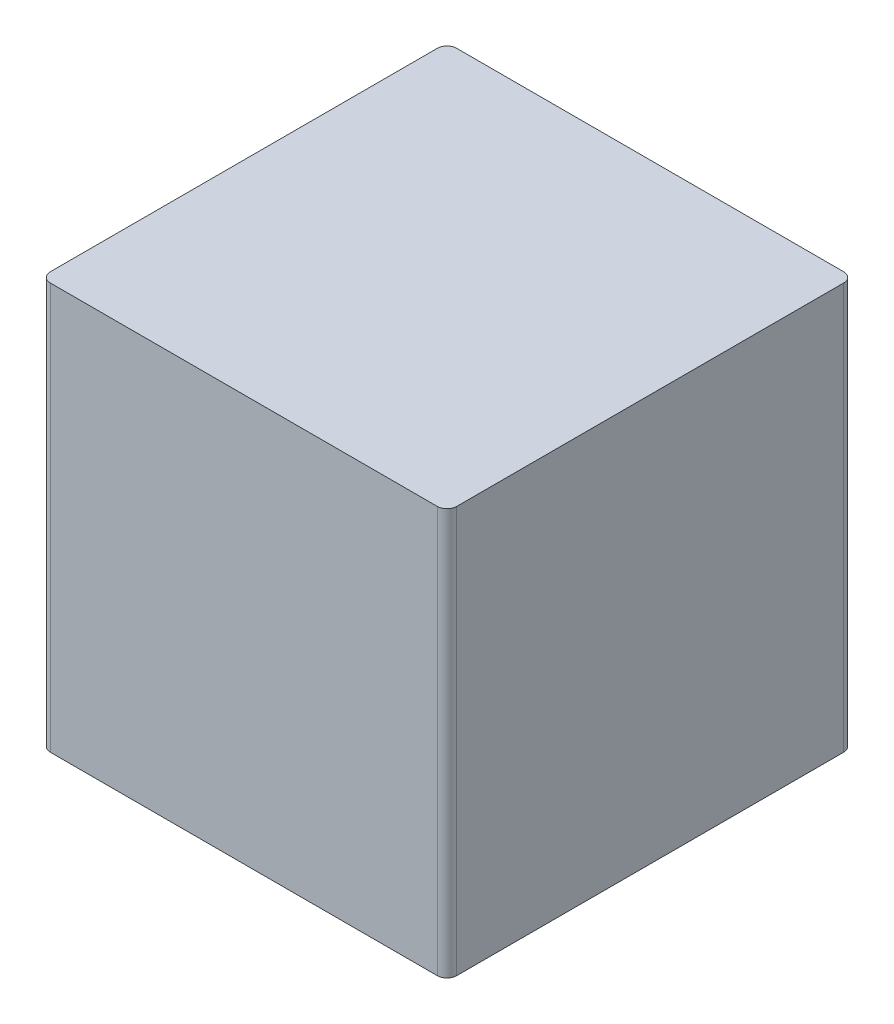
ISO-10303-21;
HEADER;
FILE_DESCRIPTION(('STEP AP214'),'2;1');
FILE_NAME('part.step','',(''),(''),'','','');
FILE_SCHEMA(('AUTOMOTIVE_DESIGN { 1 0 10303 214 1 1 1 1 }'));
ENDSEC;
DATA;
#1=APPLICATION_CONTEXT('core data for automotive mechanical design processes');
#2=APPLICATION_PROTOCOL_DEFINITION('international standard','automotive_design',2000,#1);
#3=PRODUCT_CONTEXT('',#1,'mechanical');
#4=PRODUCT('Part','Part','',(#3));
#5=PRODUCT_RELATED_PRODUCT_CATEGORY('part','',(#4));
#6=PRODUCT_DEFINITION_FORMATION('','',#4);
#7=PRODUCT_DEFINITION_CONTEXT('part definition',#1,'design');
#8=PRODUCT_DEFINITION('design','',#6,#7);
#9=PRODUCT_DEFINITION_SHAPE('','',#8);
#10=(LENGTH_UNIT() NAMED_UNIT(*) SI_UNIT(.MILLI.,.METRE.));
#11=(NAMED_UNIT(*) PLANE_ANGLE_UNIT() SI_UNIT($,.RADIAN.));
#12=(NAMED_UNIT(*) SI_UNIT($,.STERADIAN.) SOLID_ANGLE_UNIT());
#13=UNCERTAINTY_MEASURE_WITH_UNIT(LENGTH_MEASURE(1.E-05),#10,'distance_accuracy_value','');
#14=(GEOMETRIC_REPRESENTATION_CONTEXT(3) GLOBAL_UNCERTAINTY_ASSIGNED_CONTEXT((#13)) GLOBAL_UNIT_ASSIGNED_CONTEXT((#10,
#11,#12)) REPRESENTATION_CONTEXT('',''));
#15=CARTESIAN_POINT('',(0.,0.,0.));
#16=DIRECTION('',(0.,0.,1.));
#17=DIRECTION('',(1.,0.,0.));
#18=AXIS2_PLACEMENT_3D('',#15,#16,#17);
#19=CARTESIAN_POINT('',(0.,0.,0.));
#20=DIRECTION('',(0.,-1.,0.));
#21=DIRECTION('',(0.,0.,-1.));
#22=AXIS2_PLACEMENT_3D('',#19,#20,#21);
#23=PLANE('',#22);
#24=DIRECTION('',(-1.,0.,0.));
#25=VECTOR('',#24,1.);
#26=CARTESIAN_POINT('',(0.,0.,-42.));
#27=LINE('',#26,#25);
#28=CARTESIAN_POINT('',(41.,0.,-42.));
#29=VERTEX_POINT('',#28);
#30=CARTESIAN_POINT('',(1.,0.,-42.));
#31=VERTEX_POINT('',#30);
#32=EDGE_CURVE('E150',#29,#31,#27,.T.);
#33=ORIENTED_EDGE('',*,*,#32,.F.);
#34=CARTESIAN_POINT('',(41.,0.,-41.));
#35=DIRECTION('',(0.,-1.,0.));
#36=DIRECTION('',(0.,0.,-1.));
#37=AXIS2_PLACEMENT_3D('',#34,#35,#36);
#38=CIRCLE('',#37,1.);
#39=CARTESIAN_POINT('',(42.,0.,-41.));
#40=VERTEX_POINT('',#39);
#41=EDGE_CURVE('E185',#29,#40,#38,.T.);
#42=ORIENTED_EDGE('',*,*,#41,.T.);
#43=DIRECTION('',(0.,0.,-1.));
#44=VECTOR('',#43,1.);
#45=CARTESIAN_POINT('',(42.,0.,0.));
#46=LINE('',#45,#44);
#47=CARTESIAN_POINT('',(42.,0.,-1.));
#48=VERTEX_POINT('',#47);
#49=EDGE_CURVE('E146',#48,#40,#46,.T.);
#50=ORIENTED_EDGE('',*,*,#49,.F.);
#51=CARTESIAN_POINT('',(41.,0.,-1.));
#52=DIRECTION('',(0.,-1.,0.));
#53=DIRECTION('',(0.,0.,-1.));
#54=AXIS2_PLACEMENT_3D('',#51,#52,#53);
#55=CIRCLE('',#54,1.);
#56=CARTESIAN_POINT('',(41.,0.,0.));
#57=VERTEX_POINT('',#56);
#58=EDGE_CURVE('E183',#48,#57,#55,.T.);
#59=ORIENTED_EDGE('',*,*,#58,.T.);
#60=DIRECTION('',(1.,0.,0.));
#61=VECTOR('',#60,1.);
#62=CARTESIAN_POINT('',(0.,0.,0.));
#63=LINE('',#62,#61);
#64=CARTESIAN_POINT('',(1.,0.,0.));
#65=VERTEX_POINT('',#64);
#66=EDGE_CURVE('E160',#65,#57,#63,.T.);
#67=ORIENTED_EDGE('',*,*,#66,.F.);
#68=CARTESIAN_POINT('',(1.,0.,-1.));
#69=DIRECTION('',(0.,-1.,0.));
#70=DIRECTION('',(0.,0.,-1.));
#71=AXIS2_PLACEMENT_3D('',#68,#69,#70);
#72=CIRCLE('',#71,1.);
#73=CARTESIAN_POINT('',(0.,0.,-1.));
#74=VERTEX_POINT('',#73);
#75=EDGE_CURVE('E181',#65,#74,#72,.T.);
#76=ORIENTED_EDGE('',*,*,#75,.T.);
#77=DIRECTION('',(0.,0.,1.));
#78=VECTOR('',#77,1.);
#79=CARTESIAN_POINT('',(0.,0.,0.));
#80=LINE('',#79,#78);
#81=CARTESIAN_POINT('',(0.,0.,-41.));
#82=VERTEX_POINT('',#81);
#83=EDGE_CURVE('E171',#82,#74,#80,.T.);
#84=ORIENTED_EDGE('',*,*,#83,.F.);
#85=CARTESIAN_POINT('',(1.,0.,-41.));
#86=DIRECTION('',(0.,-1.,0.));
#87=DIRECTION('',(0.,0.,-1.));
#88=AXIS2_PLACEMENT_3D('',#85,#86,#87);
#89=CIRCLE('',#88,1.);
#90=EDGE_CURVE('E179',#82,#31,#89,.T.);
#91=ORIENTED_EDGE('',*,*,#90,.T.);
#92=EDGE_LOOP('',(#33,#42,#50,#59,#67,#76,#84,#91));
#93=FACE_BOUND('',#92,.T.);
#94=DIRECTION('',(1.,0.,0.));
#95=VECTOR('',#94,1.);
#96=CARTESIAN_POINT('',(0.75,0.,-0.75));
#97=LINE('',#96,#95);
#98=CARTESIAN_POINT('',(0.75,0.,-0.75));
#99=VERTEX_POINT('',#98);
#100=CARTESIAN_POINT('',(41.25,0.,-0.75));
#101=VERTEX_POINT('',#100);
#102=EDGE_CURVE('E141',#99,#101,#97,.T.);
#103=ORIENTED_EDGE('',*,*,#102,.T.);
#104=DIRECTION('',(0.,0.,-1.));
#105=VECTOR('',#104,1.);
#106=CARTESIAN_POINT('',(41.25,0.,-41.25));
#107=LINE('',#106,#105);
#108=CARTESIAN_POINT('',(41.25,0.,-41.25));
#109=VERTEX_POINT('',#108);
#110=EDGE_CURVE('E51',#101,#109,#107,.T.);
#111=ORIENTED_EDGE('',*,*,#110,.T.);
#112=DIRECTION('',(-1.,0.,0.));
#113=VECTOR('',#112,1.);
#114=CARTESIAN_POINT('',(0.749999999999997,0.,-41.25));
#115=LINE('',#114,#113);
#116=CARTESIAN_POINT('',(0.749999999999997,0.,-41.25));
#117=VERTEX_POINT('',#116);
#118=EDGE_CURVE('E145',#109,#117,#115,.T.);
#119=ORIENTED_EDGE('',*,*,#118,.T.);
#120=DIRECTION('',(0.,0.,1.));
#121=VECTOR('',#120,1.);
#122=CARTESIAN_POINT('',(0.749999999999997,0.,-41.25));
#123=LINE('',#122,#121);
#124=EDGE_CURVE('E330',#117,#99,#123,.T.);
#125=ORIENTED_EDGE('',*,*,#124,.T.);
#126=EDGE_LOOP('',(#103,#111,#119,#125));
#127=FACE_BOUND('',#126,.T.);
#128=ADVANCED_FACE('F36',(#93,#127),#23,.T.);
#129=CARTESIAN_POINT('',(42.,42.,0.));
#130=DIRECTION('',(-1.,0.,0.));
#131=DIRECTION('',(0.,0.,1.));
#132=AXIS2_PLACEMENT_3D('',#129,#130,#131);
#133=PLANE('',#132);
#134=ORIENTED_EDGE('',*,*,#49,.T.);
#135=DIRECTION('',(0.,-1.,0.));
#136=VECTOR('',#135,1.);
#137=CARTESIAN_POINT('',(42.,42.,-41.));
#138=LINE('',#137,#136);
#139=CARTESIAN_POINT('',(42.,42.,-41.));
#140=VERTEX_POINT('',#139);
#141=EDGE_CURVE('E190',#40,#140,#138,.F.);
#142=ORIENTED_EDGE('',*,*,#141,.T.);
#143=DIRECTION('',(0.,0.,-1.));
#144=VECTOR('',#143,1.);
#145=CARTESIAN_POINT('',(42.,42.,0.));
#146=LINE('',#145,#144);
#147=CARTESIAN_POINT('',(42.,42.,-1.));
#148=VERTEX_POINT('',#147);
#149=EDGE_CURVE('E156',#148,#140,#146,.T.);
#150=ORIENTED_EDGE('',*,*,#149,.F.);
#151=DIRECTION('',(0.,-1.,0.));
#152=VECTOR('',#151,1.);
#153=CARTESIAN_POINT('',(42.,42.,-1.));
#154=LINE('',#153,#152);
#155=EDGE_CURVE('E187',#148,#48,#154,.T.);
#156=ORIENTED_EDGE('',*,*,#155,.T.);
#157=EDGE_LOOP('',(#134,#142,#150,#156));
#158=FACE_BOUND('',#157,.T.);
#159=ADVANCED_FACE('F230',(#158),#133,.F.);
#160=CARTESIAN_POINT('',(0.,42.,-42.));
#161=DIRECTION('',(0.,0.,1.));
#162=DIRECTION('',(1.,0.,0.));
#163=AXIS2_PLACEMENT_3D('',#160,#161,#162);
#164=PLANE('',#163);
#165=DIRECTION('',(-1.,0.,0.));
#166=VECTOR('',#165,1.);
#167=CARTESIAN_POINT('',(0.,42.,-42.));
#168=LINE('',#167,#166);
#169=CARTESIAN_POINT('',(41.,42.,-42.));
#170=VERTEX_POINT('',#169);
#171=CARTESIAN_POINT('',(1.,42.,-42.));
#172=VERTEX_POINT('',#171);
#173=EDGE_CURVE('E159',#170,#172,#168,.T.);
#174=ORIENTED_EDGE('',*,*,#173,.F.);
#175=DIRECTION('',(0.,-1.,0.));
#176=VECTOR('',#175,1.);
#177=CARTESIAN_POINT('',(41.,42.,-42.));
#178=LINE('',#177,#176);
#179=EDGE_CURVE('E176',#170,#29,#178,.T.);
#180=ORIENTED_EDGE('',*,*,#179,.T.);
#181=ORIENTED_EDGE('',*,*,#32,.T.);
#182=DIRECTION('',(0.,-1.,0.));
#183=VECTOR('',#182,1.);
#184=CARTESIAN_POINT('',(1.,42.,-42.));
#185=LINE('',#184,#183);
#186=EDGE_CURVE('E167',#31,#172,#185,.F.);
#187=ORIENTED_EDGE('',*,*,#186,.T.);
#188=EDGE_LOOP('',(#174,#180,#181,#187));
#189=FACE_BOUND('',#188,.T.);
#190=ADVANCED_FACE('F238',(#189),#164,.F.);
#191=CARTESIAN_POINT('',(0.,42.,0.));
#192=DIRECTION('',(1.,0.,0.));
#193=DIRECTION('',(0.,0.,-1.));
#194=AXIS2_PLACEMENT_3D('',#191,#192,#193);
#195=PLANE('',#194);
#196=ORIENTED_EDGE('',*,*,#83,.T.);
#197=DIRECTION('',(0.,-1.,0.));
#198=VECTOR('',#197,1.);
#199=CARTESIAN_POINT('',(0.,42.,-1.));
#200=LINE('',#199,#198);
#201=CARTESIAN_POINT('',(0.,42.,-1.));
#202=VERTEX_POINT('',#201);
#203=EDGE_CURVE('E11',#74,#202,#200,.F.);
#204=ORIENTED_EDGE('',*,*,#203,.T.);
#205=DIRECTION('',(0.,0.,1.));
#206=VECTOR('',#205,1.);
#207=CARTESIAN_POINT('',(0.,42.,0.));
#208=LINE('',#207,#206);
#209=CARTESIAN_POINT('',(0.,42.,-41.));
#210=VERTEX_POINT('',#209);
#211=EDGE_CURVE('E163',#210,#202,#208,.T.);
#212=ORIENTED_EDGE('',*,*,#211,.F.);
#213=DIRECTION('',(0.,-1.,0.));
#214=VECTOR('',#213,1.);
#215=CARTESIAN_POINT('',(0.,42.,-41.));
#216=LINE('',#215,#214);
#217=EDGE_CURVE('E44',#210,#82,#216,.T.);
#218=ORIENTED_EDGE('',*,*,#217,.T.);
#219=EDGE_LOOP('',(#196,#204,#212,#218));
#220=FACE_BOUND('',#219,.T.);
#221=ADVANCED_FACE('F208',(#220),#195,.F.);
#222=CARTESIAN_POINT('',(0.,42.,0.));
#223=DIRECTION('',(0.,0.,-1.));
#224=DIRECTION('',(-1.,0.,0.));
#225=AXIS2_PLACEMENT_3D('',#222,#223,#224);
#226=PLANE('',#225);
#227=ORIENTED_EDGE('',*,*,#66,.T.);
#228=DIRECTION('',(0.,-1.,0.));
#229=VECTOR('',#228,1.);
#230=CARTESIAN_POINT('',(41.,42.,0.));
#231=LINE('',#230,#229);
#232=CARTESIAN_POINT('',(41.,42.,0.));
#233=VERTEX_POINT('',#232);
#234=EDGE_CURVE('E59',#57,#233,#231,.F.);
#235=ORIENTED_EDGE('',*,*,#234,.T.);
#236=DIRECTION('',(1.,0.,0.));
#237=VECTOR('',#236,1.);
#238=CARTESIAN_POINT('',(0.,42.,0.));
#239=LINE('',#238,#237);
#240=CARTESIAN_POINT('',(1.,42.,0.));
#241=VERTEX_POINT('',#240);
#242=EDGE_CURVE('E166',#241,#233,#239,.T.);
#243=ORIENTED_EDGE('',*,*,#242,.F.);
#244=DIRECTION('',(0.,-1.,0.));
#245=VECTOR('',#244,1.);
#246=CARTESIAN_POINT('',(1.,42.,0.));
#247=LINE('',#246,#245);
#248=EDGE_CURVE('E200',#241,#65,#247,.T.);
#249=ORIENTED_EDGE('',*,*,#248,.T.);
#250=EDGE_LOOP('',(#227,#235,#243,#249));
#251=FACE_BOUND('',#250,.T.);
#252=ADVANCED_FACE('F220',(#251),#226,.F.);
#253=CARTESIAN_POINT('',(0.,42.,0.));
#254=DIRECTION('',(0.,-1.,0.));
#255=DIRECTION('',(0.,0.,-1.));
#256=AXIS2_PLACEMENT_3D('',#253,#254,#255);
#257=PLANE('',#256);
#258=ORIENTED_EDGE('',*,*,#149,.T.);
#259=CARTESIAN_POINT('',(41.,42.,-41.));
#260=DIRECTION('',(0.,-1.,0.));
#261=DIRECTION('',(0.,0.,-1.));
#262=AXIS2_PLACEMENT_3D('',#259,#260,#261);
#263=CIRCLE('',#262,1.);
#264=EDGE_CURVE('E198',#140,#170,#263,.F.);
#265=ORIENTED_EDGE('',*,*,#264,.T.);
#266=ORIENTED_EDGE('',*,*,#173,.T.);
#267=CARTESIAN_POINT('',(1.,42.,-41.));
#268=DIRECTION('',(0.,-1.,0.));
#269=DIRECTION('',(0.,0.,-1.));
#270=AXIS2_PLACEMENT_3D('',#267,#268,#269);
#271=CIRCLE('',#270,1.);
#272=EDGE_CURVE('E192',#172,#210,#271,.F.);
#273=ORIENTED_EDGE('',*,*,#272,.T.);
#274=ORIENTED_EDGE('',*,*,#211,.T.);
#275=CARTESIAN_POINT('',(1.,42.,-1.));
#276=DIRECTION('',(0.,-1.,0.));
#277=DIRECTION('',(0.,0.,-1.));
#278=AXIS2_PLACEMENT_3D('',#275,#276,#277);
#279=CIRCLE('',#278,1.);
#280=EDGE_CURVE('E194',#202,#241,#279,.F.);
#281=ORIENTED_EDGE('',*,*,#280,.T.);
#282=ORIENTED_EDGE('',*,*,#242,.T.);
#283=CARTESIAN_POINT('',(41.,42.,-1.));
#284=DIRECTION('',(0.,-1.,0.));
#285=DIRECTION('',(0.,0.,-1.));
#286=AXIS2_PLACEMENT_3D('',#283,#284,#285);
#287=CIRCLE('',#286,1.);
#288=EDGE_CURVE('E196',#233,#148,#287,.F.);
#289=ORIENTED_EDGE('',*,*,#288,.T.);
#290=EDGE_LOOP('',(#258,#265,#266,#273,#274,#281,#282,#289));
#291=FACE_BOUND('',#290,.T.);
#292=ADVANCED_FACE('F223',(#291),#257,.F.);
#293=CARTESIAN_POINT('',(41.,42.,-41.));
#294=DIRECTION('',(0.,-1.,0.));
#295=DIRECTION('',(0.,0.,-1.));
#296=AXIS2_PLACEMENT_3D('',#293,#294,#295);
#297=CYLINDRICAL_SURFACE('',#296,1.);
#298=ORIENTED_EDGE('',*,*,#264,.F.);
#299=ORIENTED_EDGE('',*,*,#141,.F.);
#300=ORIENTED_EDGE('',*,*,#41,.F.);
#301=ORIENTED_EDGE('',*,*,#179,.F.);
#302=EDGE_LOOP('',(#298,#299,#300,#301));
#303=FACE_BOUND('',#302,.T.);
#304=ADVANCED_FACE('F235',(#303),#297,.T.);
#305=CARTESIAN_POINT('',(41.,42.,-1.));
#306=DIRECTION('',(0.,-1.,0.));
#307=DIRECTION('',(0.,0.,-1.));
#308=AXIS2_PLACEMENT_3D('',#305,#306,#307);
#309=CYLINDRICAL_SURFACE('',#308,1.);
#310=ORIENTED_EDGE('',*,*,#288,.F.);
#311=ORIENTED_EDGE('',*,*,#234,.F.);
#312=ORIENTED_EDGE('',*,*,#58,.F.);
#313=ORIENTED_EDGE('',*,*,#155,.F.);
#314=EDGE_LOOP('',(#310,#311,#312,#313));
#315=FACE_BOUND('',#314,.T.);
#316=ADVANCED_FACE('F227',(#315),#309,.T.);
#317=CARTESIAN_POINT('',(1.,42.,-1.));
#318=DIRECTION('',(0.,-1.,0.));
#319=DIRECTION('',(0.,0.,-1.));
#320=AXIS2_PLACEMENT_3D('',#317,#318,#319);
#321=CYLINDRICAL_SURFACE('',#320,1.);
#322=ORIENTED_EDGE('',*,*,#280,.F.);
#323=ORIENTED_EDGE('',*,*,#203,.F.);
#324=ORIENTED_EDGE('',*,*,#75,.F.);
#325=ORIENTED_EDGE('',*,*,#248,.F.);
#326=EDGE_LOOP('',(#322,#323,#324,#325));
#327=FACE_BOUND('',#326,.T.);
#328=ADVANCED_FACE('F219',(#327),#321,.T.);
#329=CARTESIAN_POINT('',(1.,42.,-41.));
#330=DIRECTION('',(0.,-1.,0.));
#331=DIRECTION('',(0.,0.,-1.));
#332=AXIS2_PLACEMENT_3D('',#329,#330,#331);
#333=CYLINDRICAL_SURFACE('',#332,1.);
#334=ORIENTED_EDGE('',*,*,#272,.F.);
#335=ORIENTED_EDGE('',*,*,#186,.F.);
#336=ORIENTED_EDGE('',*,*,#90,.F.);
#337=ORIENTED_EDGE('',*,*,#217,.F.);
#338=EDGE_LOOP('',(#334,#335,#336,#337));
#339=FACE_BOUND('',#338,.T.);
#340=ADVANCED_FACE('F38',(#339),#333,.T.);
#341=CARTESIAN_POINT('',(41.25,1.,-41.25));
#342=DIRECTION('',(-1.,0.,0.));
#343=DIRECTION('',(0.,0.,1.));
#344=AXIS2_PLACEMENT_3D('',#341,#342,#343);
#345=PLANE('',#344);
#346=ORIENTED_EDGE('',*,*,#110,.F.);
#347=DIRECTION('',(0.,-1.,0.));
#348=VECTOR('',#347,1.);
#349=CARTESIAN_POINT('',(41.25,1.,-0.75));
#350=LINE('',#349,#348);
#351=CARTESIAN_POINT('',(41.25,1.,-0.75));
#352=VERTEX_POINT('',#351);
#353=EDGE_CURVE('E140',#352,#101,#350,.T.);
#354=ORIENTED_EDGE('',*,*,#353,.F.);
#355=DIRECTION('',(0.,0.,-1.));
#356=VECTOR('',#355,1.);
#357=CARTESIAN_POINT('',(41.25,1.,-41.25));
#358=LINE('',#357,#356);
#359=CARTESIAN_POINT('',(41.25,1.,-41.25));
#360=VERTEX_POINT('',#359);
#361=EDGE_CURVE('E132',#352,#360,#358,.T.);
#362=ORIENTED_EDGE('',*,*,#361,.T.);
#363=DIRECTION('',(0.,-1.,0.));
#364=VECTOR('',#363,1.);
#365=CARTESIAN_POINT('',(41.25,1.,-41.25));
#366=LINE('',#365,#364);
#367=EDGE_CURVE('E139',#360,#109,#366,.T.);
#368=ORIENTED_EDGE('',*,*,#367,.T.);
#369=EDGE_LOOP('',(#346,#354,#362,#368));
#370=FACE_BOUND('',#369,.T.);
#371=ADVANCED_FACE('F138',(#370),#345,.T.);
#372=CARTESIAN_POINT('',(0.749999999999997,1.,-41.25));
#373=DIRECTION('',(0.,0.,1.));
#374=DIRECTION('',(1.,0.,0.));
#375=AXIS2_PLACEMENT_3D('',#372,#373,#374);
#376=PLANE('',#375);
#377=ORIENTED_EDGE('',*,*,#118,.F.);
#378=ORIENTED_EDGE('',*,*,#367,.F.);
#379=DIRECTION('',(-1.,0.,0.));
#380=VECTOR('',#379,1.);
#381=CARTESIAN_POINT('',(0.749999999999997,1.,-41.25));
#382=LINE('',#381,#380);
#383=CARTESIAN_POINT('',(0.749999999999997,1.,-41.25));
#384=VERTEX_POINT('',#383);
#385=EDGE_CURVE('E128',#360,#384,#382,.T.);
#386=ORIENTED_EDGE('',*,*,#385,.T.);
#387=DIRECTION('',(0.,-1.,0.));
#388=VECTOR('',#387,1.);
#389=CARTESIAN_POINT('',(0.749999999999997,1.,-41.25));
#390=LINE('',#389,#388);
#391=EDGE_CURVE('E147',#384,#117,#390,.T.);
#392=ORIENTED_EDGE('',*,*,#391,.T.);
#393=EDGE_LOOP('',(#377,#378,#386,#392));
#394=FACE_BOUND('',#393,.T.);
#395=ADVANCED_FACE('F143',(#394),#376,.T.);
#396=CARTESIAN_POINT('',(0.749999999999997,1.,-41.25));
#397=DIRECTION('',(1.,0.,0.));
#398=DIRECTION('',(0.,0.,-1.));
#399=AXIS2_PLACEMENT_3D('',#396,#397,#398);
#400=PLANE('',#399);
#401=ORIENTED_EDGE('',*,*,#124,.F.);
#402=ORIENTED_EDGE('',*,*,#391,.F.);
#403=DIRECTION('',(0.,0.,1.));
#404=VECTOR('',#403,1.);
#405=CARTESIAN_POINT('',(0.749999999999997,1.,-41.25));
#406=LINE('',#405,#404);
#407=CARTESIAN_POINT('',(0.75,1.,-0.75));
#408=VERTEX_POINT('',#407);
#409=EDGE_CURVE('E133',#384,#408,#406,.T.);
#410=ORIENTED_EDGE('',*,*,#409,.T.);
#411=DIRECTION('',(0.,-1.,0.));
#412=VECTOR('',#411,1.);
#413=CARTESIAN_POINT('',(0.75,1.,-0.75));
#414=LINE('',#413,#412);
#415=EDGE_CURVE('E152',#408,#99,#414,.T.);
#416=ORIENTED_EDGE('',*,*,#415,.T.);
#417=EDGE_LOOP('',(#401,#402,#410,#416));
#418=FACE_BOUND('',#417,.T.);
#419=ADVANCED_FACE('F295',(#418),#400,.T.);
#420=CARTESIAN_POINT('',(0.75,1.,-0.75));
#421=DIRECTION('',(0.,0.,-1.));
#422=DIRECTION('',(-1.,0.,0.));
#423=AXIS2_PLACEMENT_3D('',#420,#421,#422);
#424=PLANE('',#423);
#425=ORIENTED_EDGE('',*,*,#102,.F.);
#426=ORIENTED_EDGE('',*,*,#415,.F.);
#427=DIRECTION('',(1.,0.,0.));
#428=VECTOR('',#427,1.);
#429=CARTESIAN_POINT('',(0.75,1.,-0.75));
#430=LINE('',#429,#428);
#431=EDGE_CURVE('E337',#408,#352,#430,.T.);
#432=ORIENTED_EDGE('',*,*,#431,.T.);
#433=ORIENTED_EDGE('',*,*,#353,.T.);
#434=EDGE_LOOP('',(#425,#426,#432,#433));
#435=FACE_BOUND('',#434,.T.);
#436=ADVANCED_FACE('F304',(#435),#424,.T.);
#437=CARTESIAN_POINT('',(0.,1.,0.));
#438=DIRECTION('',(0.,1.,0.));
#439=DIRECTION('',(0.,0.,1.));
#440=AXIS2_PLACEMENT_3D('',#437,#438,#439);
#441=PLANE('',#440);
#442=ORIENTED_EDGE('',*,*,#361,.F.);
#443=ORIENTED_EDGE('',*,*,#431,.F.);
#444=ORIENTED_EDGE('',*,*,#409,.F.);
#445=ORIENTED_EDGE('',*,*,#385,.F.);
#446=EDGE_LOOP('',(#442,#443,#444,#445));
#447=FACE_BOUND('',#446,.T.);
#448=ADVANCED_FACE('F130',(#447),#441,.F.);
#449=CLOSED_SHELL('',(#128,#159,#190,#221,#252,#292,#304,#316,#328,#340,#371,#395,#419,#436,#448));
#450=MANIFOLD_SOLID_BREP('B2',#449);
#451=ADVANCED_BREP_SHAPE_REPRESENTATION('',(#18,#450),#14);
#452=SHAPE_DEFINITION_REPRESENTATION(#9,#451);
ENDSEC;
END-ISO-10303-21;
